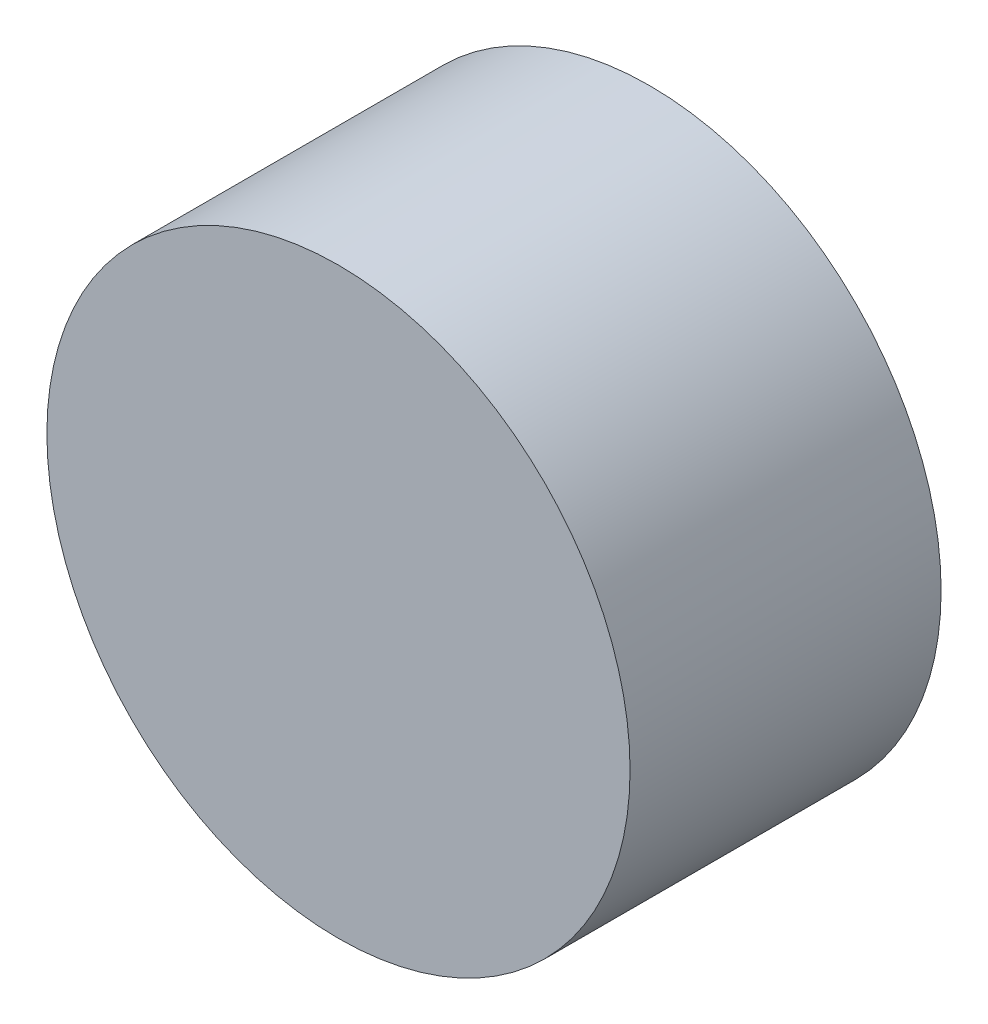
ISO-10303-21;
HEADER;
FILE_DESCRIPTION(('STEP AP214'),'2;1');
FILE_NAME('part.step','',(''),(''),'','','');
FILE_SCHEMA(('AUTOMOTIVE_DESIGN { 1 0 10303 214 1 1 1 1 }'));
ENDSEC;
DATA;
#1=APPLICATION_CONTEXT('core data for automotive mechanical design processes');
#2=APPLICATION_PROTOCOL_DEFINITION('international standard','automotive_design',2000,#1);
#3=PRODUCT_CONTEXT('',#1,'mechanical');
#4=PRODUCT('Part','Part','',(#3));
#5=PRODUCT_RELATED_PRODUCT_CATEGORY('part','',(#4));
#6=PRODUCT_DEFINITION_FORMATION('','',#4);
#7=PRODUCT_DEFINITION_CONTEXT('part definition',#1,'design');
#8=PRODUCT_DEFINITION('design','',#6,#7);
#9=PRODUCT_DEFINITION_SHAPE('','',#8);
#10=(LENGTH_UNIT() NAMED_UNIT(*) SI_UNIT(.MILLI.,.METRE.));
#11=(NAMED_UNIT(*) PLANE_ANGLE_UNIT() SI_UNIT($,.RADIAN.));
#12=(NAMED_UNIT(*) SI_UNIT($,.STERADIAN.) SOLID_ANGLE_UNIT());
#13=UNCERTAINTY_MEASURE_WITH_UNIT(LENGTH_MEASURE(1.E-05),#10,'distance_accuracy_value','');
#14=(GEOMETRIC_REPRESENTATION_CONTEXT(3) GLOBAL_UNCERTAINTY_ASSIGNED_CONTEXT((#13)) GLOBAL_UNIT_ASSIGNED_CONTEXT((#10,
#11,#12)) REPRESENTATION_CONTEXT('',''));
#15=CARTESIAN_POINT('',(0.,0.,0.));
#16=DIRECTION('',(0.,0.,1.));
#17=DIRECTION('',(1.,0.,0.));
#18=AXIS2_PLACEMENT_3D('',#15,#16,#17);
#19=CARTESIAN_POINT('',(0.,0.,32.));
#20=DIRECTION('',(0.,0.,-1.));
#21=DIRECTION('',(-1.,0.,0.));
#22=AXIS2_PLACEMENT_3D('',#19,#20,#21);
#23=CYLINDRICAL_SURFACE('',#22,30.);
#24=CARTESIAN_POINT('',(0.,0.,32.));
#25=DIRECTION('',(0.,0.,1.));
#26=DIRECTION('',(1.,0.,0.));
#27=AXIS2_PLACEMENT_3D('',#24,#25,#26);
#28=CIRCLE('',#27,30.);
#29=CARTESIAN_POINT('',(30.,0.,32.));
#30=VERTEX_POINT('',#29);
#31=EDGE_CURVE('E51',#30,#30,#28,.T.);
#32=ORIENTED_EDGE('',*,*,#31,.F.);
#33=EDGE_LOOP('',(#32));
#34=FACE_BOUND('',#33,.T.);
#35=CARTESIAN_POINT('',(0.,0.,0.));
#36=DIRECTION('',(0.,0.,1.));
#37=DIRECTION('',(1.,0.,0.));
#38=AXIS2_PLACEMENT_3D('',#35,#36,#37);
#39=CIRCLE('',#38,30.);
#40=CARTESIAN_POINT('',(30.,0.,0.));
#41=VERTEX_POINT('',#40);
#42=EDGE_CURVE('E40',#41,#41,#39,.T.);
#43=ORIENTED_EDGE('',*,*,#42,.T.);
#44=EDGE_LOOP('',(#43));
#45=FACE_BOUND('',#44,.T.);
#46=ADVANCED_FACE('F37',(#34,#45),#23,.T.);
#47=CARTESIAN_POINT('',(0.,0.,32.));
#48=DIRECTION('',(0.,0.,1.));
#49=DIRECTION('',(1.,0.,0.));
#50=AXIS2_PLACEMENT_3D('',#47,#48,#49);
#51=PLANE('',#50);
#52=ORIENTED_EDGE('',*,*,#31,.T.);
#53=EDGE_LOOP('',(#52));
#54=FACE_BOUND('',#53,.T.);
#55=ADVANCED_FACE('F72',(#54),#51,.T.);
#56=CARTESIAN_POINT('',(0.,0.,0.));
#57=DIRECTION('',(0.,0.,1.));
#58=DIRECTION('',(1.,0.,0.));
#59=AXIS2_PLACEMENT_3D('',#56,#57,#58);
#60=PLANE('',#59);
#61=CARTESIAN_POINT('',(0.,0.,0.));
#62=DIRECTION('',(0.,0.,-1.));
#63=DIRECTION('',(-1.,0.,0.));
#64=AXIS2_PLACEMENT_3D('',#61,#62,#63);
#65=CIRCLE('',#64,14.9966365776405);
#66=CARTESIAN_POINT('',(-14.9966365776405,0.,0.));
#67=VERTEX_POINT('',#66);
#68=EDGE_CURVE('E45',#67,#67,#65,.T.);
#69=ORIENTED_EDGE('',*,*,#68,.F.);
#70=EDGE_LOOP('',(#69));
#71=FACE_BOUND('',#70,.T.);
#72=ORIENTED_EDGE('',*,*,#42,.F.);
#73=EDGE_LOOP('',(#72));
#74=FACE_BOUND('',#73,.T.);
#75=ADVANCED_FACE('F69',(#71,#74),#60,.F.);
#76=CARTESIAN_POINT('',(0.,0.,-2.));
#77=DIRECTION('',(0.,0.,1.));
#78=DIRECTION('',(1.,0.,0.));
#79=AXIS2_PLACEMENT_3D('',#76,#77,#78);
#80=CYLINDRICAL_SURFACE('',#79,14.9966365776405);
#81=CARTESIAN_POINT('',(0.,0.,-2.));
#82=DIRECTION('',(0.,0.,-1.));
#83=DIRECTION('',(-1.,0.,0.));
#84=AXIS2_PLACEMENT_3D('',#81,#82,#83);
#85=CIRCLE('',#84,14.9966365776405);
#86=CARTESIAN_POINT('',(-14.9966365776405,0.,-2.));
#87=VERTEX_POINT('',#86);
#88=EDGE_CURVE('E57',#87,#87,#85,.T.);
#89=ORIENTED_EDGE('',*,*,#88,.F.);
#90=EDGE_LOOP('',(#89));
#91=FACE_BOUND('',#90,.T.);
#92=ORIENTED_EDGE('',*,*,#68,.T.);
#93=EDGE_LOOP('',(#92));
#94=FACE_BOUND('',#93,.T.);
#95=ADVANCED_FACE('F71',(#91,#94),#80,.T.);
#96=CARTESIAN_POINT('',(0.,0.,-2.));
#97=DIRECTION('',(0.,0.,-1.));
#98=DIRECTION('',(-1.,0.,0.));
#99=AXIS2_PLACEMENT_3D('',#96,#97,#98);
#100=PLANE('',#99);
#101=CARTESIAN_POINT('',(0.,0.,-2.));
#102=DIRECTION('',(0.,0.,-1.));
#103=DIRECTION('',(-1.,0.,0.));
#104=AXIS2_PLACEMENT_3D('',#101,#102,#103);
#105=CIRCLE('',#104,4.75);
#106=CARTESIAN_POINT('',(-4.75,0.,-2.));
#107=VERTEX_POINT('',#106);
#108=EDGE_CURVE('E10',#107,#107,#105,.T.);
#109=ORIENTED_EDGE('',*,*,#108,.F.);
#110=EDGE_LOOP('',(#109));
#111=FACE_BOUND('',#110,.T.);
#112=ORIENTED_EDGE('',*,*,#88,.T.);
#113=EDGE_LOOP('',(#112));
#114=FACE_BOUND('',#113,.T.);
#115=ADVANCED_FACE('F78',(#111,#114),#100,.T.);
#116=CARTESIAN_POINT('',(0.,0.,-12.));
#117=DIRECTION('',(0.,0.,1.));
#118=DIRECTION('',(1.,0.,0.));
#119=AXIS2_PLACEMENT_3D('',#116,#117,#118);
#120=CYLINDRICAL_SURFACE('',#119,4.75);
#121=CARTESIAN_POINT('',(0.,0.,-12.));
#122=DIRECTION('',(0.,0.,-1.));
#123=DIRECTION('',(-1.,0.,0.));
#124=AXIS2_PLACEMENT_3D('',#121,#122,#123);
#125=CIRCLE('',#124,4.75);
#126=CARTESIAN_POINT('',(-4.75,0.,-12.));
#127=VERTEX_POINT('',#126);
#128=EDGE_CURVE('E55',#127,#127,#125,.T.);
#129=ORIENTED_EDGE('',*,*,#128,.F.);
#130=EDGE_LOOP('',(#129));
#131=FACE_BOUND('',#130,.T.);
#132=ORIENTED_EDGE('',*,*,#108,.T.);
#133=EDGE_LOOP('',(#132));
#134=FACE_BOUND('',#133,.T.);
#135=ADVANCED_FACE('F110',(#131,#134),#120,.T.);
#136=CARTESIAN_POINT('',(0.,0.,-12.));
#137=DIRECTION('',(0.,0.,-1.));
#138=DIRECTION('',(-1.,0.,0.));
#139=AXIS2_PLACEMENT_3D('',#136,#137,#138);
#140=PLANE('',#139);
#141=CARTESIAN_POINT('',(0.,0.,-12.));
#142=DIRECTION('',(0.,0.,-1.));
#143=DIRECTION('',(-1.,0.,0.));
#144=AXIS2_PLACEMENT_3D('',#141,#142,#143);
#145=CIRCLE('',#144,4.);
#146=CARTESIAN_POINT('',(-4.,0.,-12.));
#147=VERTEX_POINT('',#146);
#148=EDGE_CURVE('E158',#147,#147,#145,.T.);
#149=ORIENTED_EDGE('',*,*,#148,.F.);
#150=EDGE_LOOP('',(#149));
#151=FACE_BOUND('',#150,.T.);
#152=ORIENTED_EDGE('',*,*,#128,.T.);
#153=EDGE_LOOP('',(#152));
#154=FACE_BOUND('',#153,.T.);
#155=ADVANCED_FACE('F120',(#151,#154),#140,.T.);
#156=CARTESIAN_POINT('',(0.,0.,-2.));
#157=DIRECTION('',(0.,0.,-1.));
#158=DIRECTION('',(-1.,0.,0.));
#159=AXIS2_PLACEMENT_3D('',#156,#157,#158);
#160=CYLINDRICAL_SURFACE('',#159,4.);
#161=CARTESIAN_POINT('',(0.,0.,-2.));
#162=DIRECTION('',(0.,0.,-1.));
#163=DIRECTION('',(-1.,0.,0.));
#164=AXIS2_PLACEMENT_3D('',#161,#162,#163);
#165=CIRCLE('',#164,4.);
#166=CARTESIAN_POINT('',(-4.,0.,-2.));
#167=VERTEX_POINT('',#166);
#168=EDGE_CURVE('E156',#167,#167,#165,.T.);
#169=ORIENTED_EDGE('',*,*,#168,.F.);
#170=EDGE_LOOP('',(#169));
#171=FACE_BOUND('',#170,.T.);
#172=ORIENTED_EDGE('',*,*,#148,.T.);
#173=EDGE_LOOP('',(#172));
#174=FACE_BOUND('',#173,.T.);
#175=ADVANCED_FACE('F130',(#171,#174),#160,.F.);
#176=CARTESIAN_POINT('',(0.,0.,-2.));
#177=DIRECTION('',(0.,0.,-1.));
#178=DIRECTION('',(-1.,0.,0.));
#179=AXIS2_PLACEMENT_3D('',#176,#177,#178);
#180=PLANE('',#179);
#181=ORIENTED_EDGE('',*,*,#168,.T.);
#182=EDGE_LOOP('',(#181));
#183=FACE_BOUND('',#182,.T.);
#184=ADVANCED_FACE('F140',(#183),#180,.T.);
#185=CLOSED_SHELL('',(#46,#55,#75,#95,#115,#135,#155,#175,#184));
#186=MANIFOLD_SOLID_BREP('B2',#185);
#187=ADVANCED_BREP_SHAPE_REPRESENTATION('',(#18,#186),#14);
#188=SHAPE_DEFINITION_REPRESENTATION(#9,#187);
ENDSEC;
END-ISO-10303-21;
